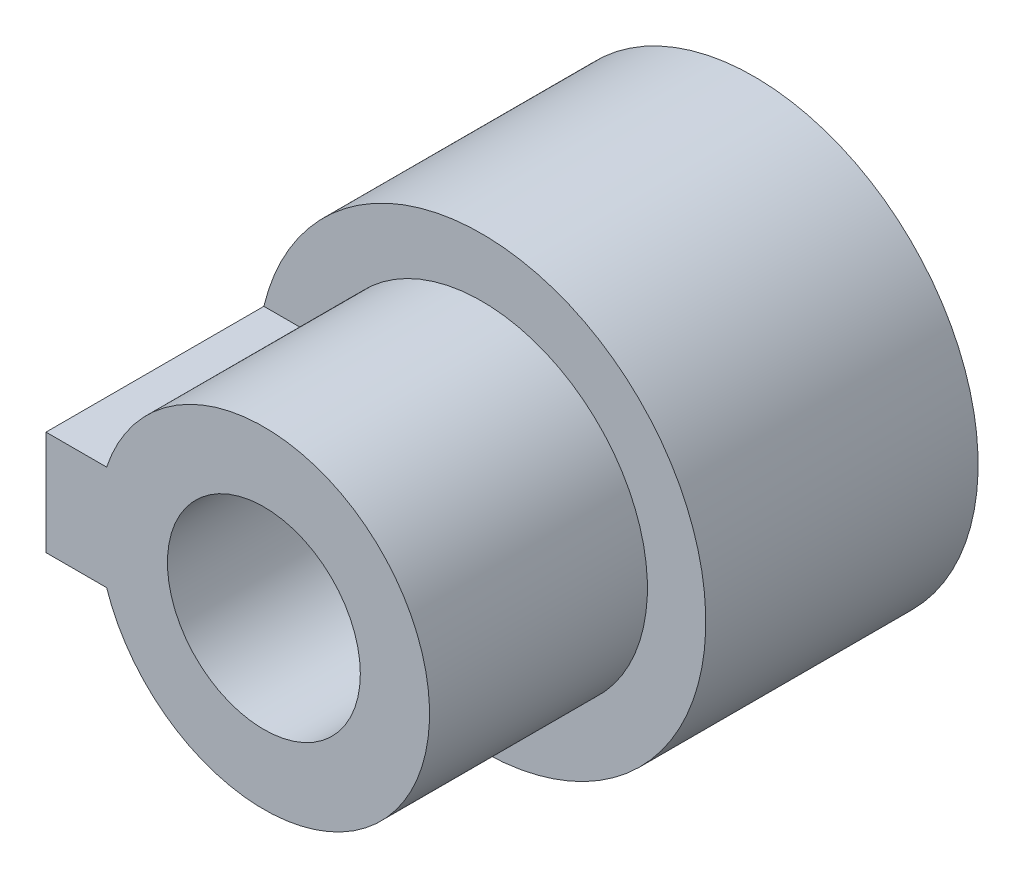
ISO-10303-21;
HEADER;
FILE_DESCRIPTION(('STEP AP214'),'2;1');
FILE_NAME('part.step','',(''),(''),'','','');
FILE_SCHEMA(('AUTOMOTIVE_DESIGN { 1 0 10303 214 1 1 1 1 }'));
ENDSEC;
DATA;
#1=APPLICATION_CONTEXT('core data for automotive mechanical design processes');
#2=APPLICATION_PROTOCOL_DEFINITION('international standard','automotive_design',2000,#1);
#3=PRODUCT_CONTEXT('',#1,'mechanical');
#4=PRODUCT('Part','Part','',(#3));
#5=PRODUCT_RELATED_PRODUCT_CATEGORY('part','',(#4));
#6=PRODUCT_DEFINITION_FORMATION('','',#4);
#7=PRODUCT_DEFINITION_CONTEXT('part definition',#1,'design');
#8=PRODUCT_DEFINITION('design','',#6,#7);
#9=PRODUCT_DEFINITION_SHAPE('','',#8);
#10=(LENGTH_UNIT() NAMED_UNIT(*) SI_UNIT(.MILLI.,.METRE.));
#11=(NAMED_UNIT(*) PLANE_ANGLE_UNIT() SI_UNIT($,.RADIAN.));
#12=(NAMED_UNIT(*) SI_UNIT($,.STERADIAN.) SOLID_ANGLE_UNIT());
#13=UNCERTAINTY_MEASURE_WITH_UNIT(LENGTH_MEASURE(1.E-05),#10,'distance_accuracy_value','');
#14=(GEOMETRIC_REPRESENTATION_CONTEXT(3) GLOBAL_UNCERTAINTY_ASSIGNED_CONTEXT((#13)) GLOBAL_UNIT_ASSIGNED_CONTEXT((#10,
#11,#12)) REPRESENTATION_CONTEXT('',''));
#15=CARTESIAN_POINT('',(0.,0.,0.));
#16=DIRECTION('',(0.,0.,1.));
#17=DIRECTION('',(1.,0.,0.));
#18=AXIS2_PLACEMENT_3D('',#15,#16,#17);
#19=CARTESIAN_POINT('',(0.,-2.3,10.));
#20=DIRECTION('',(0.,1.,0.));
#21=DIRECTION('',(-1.,0.,0.));
#22=AXIS2_PLACEMENT_3D('',#19,#20,#21);
#23=PLANE('',#22);
#24=DIRECTION('',(1.,0.,0.));
#25=VECTOR('',#24,1.);
#26=CARTESIAN_POINT('',(-9.6,-2.3,14.6));
#27=LINE('',#26,#25);
#28=CARTESIAN_POINT('',(-9.6,-2.3,14.6));
#29=VERTEX_POINT('',#28);
#30=CARTESIAN_POINT('',(-6.92820323027551,-2.3,14.6));
#31=VERTEX_POINT('',#30);
#32=EDGE_CURVE('E113',#29,#31,#27,.T.);
#33=ORIENTED_EDGE('',*,*,#32,.F.);
#34=DIRECTION('',(0.,0.,-1.));
#35=VECTOR('',#34,1.);
#36=CARTESIAN_POINT('',(-9.6,-2.3,10.));
#37=LINE('',#36,#35);
#38=CARTESIAN_POINT('',(-9.6,-2.3,5.));
#39=VERTEX_POINT('',#38);
#40=EDGE_CURVE('E58',#29,#39,#37,.T.);
#41=ORIENTED_EDGE('',*,*,#40,.T.);
#42=DIRECTION('',(1.,0.,0.));
#43=VECTOR('',#42,1.);
#44=CARTESIAN_POINT('',(0.,-2.3,5.));
#45=LINE('',#44,#43);
#46=CARTESIAN_POINT('',(-6.92820323027551,-2.3,5.));
#47=VERTEX_POINT('',#46);
#48=EDGE_CURVE('E224',#39,#47,#45,.T.);
#49=ORIENTED_EDGE('',*,*,#48,.T.);
#50=DIRECTION('',(0.,0.,-1.));
#51=VECTOR('',#50,1.);
#52=CARTESIAN_POINT('',(-6.92820323027551,-2.3,10.));
#53=LINE('',#52,#51);
#54=EDGE_CURVE('E119',#31,#47,#53,.T.);
#55=ORIENTED_EDGE('',*,*,#54,.F.);
#56=EDGE_LOOP('',(#33,#41,#49,#55));
#57=FACE_BOUND('',#56,.T.);
#58=ADVANCED_FACE('F35',(#57),#23,.F.);
#59=CARTESIAN_POINT('',(0.,0.,10.));
#60=DIRECTION('',(0.,0.,-1.));
#61=DIRECTION('',(-1.,0.,0.));
#62=AXIS2_PLACEMENT_3D('',#59,#60,#61);
#63=CYLINDRICAL_SURFACE('',#62,7.3);
#64=CARTESIAN_POINT('',(0.,0.,14.6));
#65=DIRECTION('',(0.,0.,1.));
#66=DIRECTION('',(1.,0.,0.));
#67=AXIS2_PLACEMENT_3D('',#64,#65,#66);
#68=CIRCLE('',#67,7.3);
#69=CARTESIAN_POINT('',(-6.92820323027551,2.29999999999999,14.6));
#70=VERTEX_POINT('',#69);
#71=EDGE_CURVE('E120',#31,#70,#68,.T.);
#72=ORIENTED_EDGE('',*,*,#71,.F.);
#73=ORIENTED_EDGE('',*,*,#54,.T.);
#74=CARTESIAN_POINT('',(0.,0.,5.));
#75=DIRECTION('',(0.,0.,1.));
#76=DIRECTION('',(1.,0.,0.));
#77=AXIS2_PLACEMENT_3D('',#74,#75,#76);
#78=CIRCLE('',#77,7.3);
#79=CARTESIAN_POINT('',(-6.92820323027551,2.3,5.));
#80=VERTEX_POINT('',#79);
#81=EDGE_CURVE('E214',#47,#80,#78,.T.);
#82=ORIENTED_EDGE('',*,*,#81,.T.);
#83=DIRECTION('',(0.,0.,-1.));
#84=VECTOR('',#83,1.);
#85=CARTESIAN_POINT('',(-6.92820323027551,2.3,10.));
#86=LINE('',#85,#84);
#87=EDGE_CURVE('E127',#70,#80,#86,.T.);
#88=ORIENTED_EDGE('',*,*,#87,.F.);
#89=EDGE_LOOP('',(#72,#73,#82,#88));
#90=FACE_BOUND('',#89,.T.);
#91=ADVANCED_FACE('F189',(#90),#63,.T.);
#92=CARTESIAN_POINT('',(0.,2.3,10.));
#93=DIRECTION('',(0.,1.,0.));
#94=DIRECTION('',(0.,0.,1.));
#95=AXIS2_PLACEMENT_3D('',#92,#93,#94);
#96=PLANE('',#95);
#97=DIRECTION('',(0.,0.,-1.));
#98=VECTOR('',#97,1.);
#99=CARTESIAN_POINT('',(-9.6,2.3,10.));
#100=LINE('',#99,#98);
#101=CARTESIAN_POINT('',(-9.6,2.3,14.6));
#102=VERTEX_POINT('',#101);
#103=CARTESIAN_POINT('',(-9.6,2.29999999999999,5.));
#104=VERTEX_POINT('',#103);
#105=EDGE_CURVE('E124',#102,#104,#100,.T.);
#106=ORIENTED_EDGE('',*,*,#105,.F.);
#107=DIRECTION('',(-1.,0.,0.));
#108=VECTOR('',#107,1.);
#109=CARTESIAN_POINT('',(-6.92820323027551,2.29999999999999,14.6));
#110=LINE('',#109,#108);
#111=EDGE_CURVE('E50',#70,#102,#110,.T.);
#112=ORIENTED_EDGE('',*,*,#111,.F.);
#113=ORIENTED_EDGE('',*,*,#87,.T.);
#114=DIRECTION('',(1.,0.,0.));
#115=VECTOR('',#114,1.);
#116=CARTESIAN_POINT('',(0.,2.3,5.));
#117=LINE('',#116,#115);
#118=EDGE_CURVE('E221',#104,#80,#117,.T.);
#119=ORIENTED_EDGE('',*,*,#118,.F.);
#120=EDGE_LOOP('',(#106,#112,#113,#119));
#121=FACE_BOUND('',#120,.T.);
#122=ADVANCED_FACE('F193',(#121),#96,.T.);
#123=CARTESIAN_POINT('',(-9.6,0.,10.));
#124=DIRECTION('',(1.,0.,0.));
#125=DIRECTION('',(0.,0.,-1.));
#126=AXIS2_PLACEMENT_3D('',#123,#124,#125);
#127=PLANE('',#126);
#128=DIRECTION('',(0.,-1.,0.));
#129=VECTOR('',#128,1.);
#130=CARTESIAN_POINT('',(-9.6,2.3,14.6));
#131=LINE('',#130,#129);
#132=EDGE_CURVE('E111',#102,#29,#131,.T.);
#133=ORIENTED_EDGE('',*,*,#132,.F.);
#134=ORIENTED_EDGE('',*,*,#105,.T.);
#135=DIRECTION('',(0.,-1.,0.));
#136=VECTOR('',#135,1.);
#137=CARTESIAN_POINT('',(-9.6,0.,5.));
#138=LINE('',#137,#136);
#139=EDGE_CURVE('E11',#104,#39,#138,.T.);
#140=ORIENTED_EDGE('',*,*,#139,.T.);
#141=ORIENTED_EDGE('',*,*,#40,.F.);
#142=EDGE_LOOP('',(#133,#134,#140,#141));
#143=FACE_BOUND('',#142,.T.);
#144=ADVANCED_FACE('F122',(#143),#127,.F.);
#145=CARTESIAN_POINT('',(0.,0.,10.));
#146=DIRECTION('',(0.,0.,-1.));
#147=DIRECTION('',(-1.,0.,0.));
#148=AXIS2_PLACEMENT_3D('',#145,#146,#147);
#149=CYLINDRICAL_SURFACE('',#148,4.25);
#150=CARTESIAN_POINT('',(0.,0.,0.));
#151=DIRECTION('',(0.,0.,1.));
#152=DIRECTION('',(1.,0.,0.));
#153=AXIS2_PLACEMENT_3D('',#150,#151,#152);
#154=CIRCLE('',#153,4.25);
#155=CARTESIAN_POINT('',(4.25,0.,0.));
#156=VERTEX_POINT('',#155);
#157=EDGE_CURVE('E125',#156,#156,#154,.T.);
#158=ORIENTED_EDGE('',*,*,#157,.F.);
#159=EDGE_LOOP('',(#158));
#160=FACE_BOUND('',#159,.T.);
#161=CARTESIAN_POINT('',(0.,0.,14.6));
#162=DIRECTION('',(0.,0.,1.));
#163=DIRECTION('',(1.,0.,0.));
#164=AXIS2_PLACEMENT_3D('',#161,#162,#163);
#165=CIRCLE('',#164,4.25);
#166=CARTESIAN_POINT('',(4.25,0.,14.6));
#167=VERTEX_POINT('',#166);
#168=EDGE_CURVE('E38',#167,#167,#165,.T.);
#169=ORIENTED_EDGE('',*,*,#168,.T.);
#170=EDGE_LOOP('',(#169));
#171=FACE_BOUND('',#170,.T.);
#172=ADVANCED_FACE('F202',(#160,#171),#149,.F.);
#173=CARTESIAN_POINT('',(0.,0.,0.));
#174=DIRECTION('',(0.,0.,1.));
#175=DIRECTION('',(1.,0.,0.));
#176=AXIS2_PLACEMENT_3D('',#173,#174,#175);
#177=PLANE('',#176);
#178=DIRECTION('',(0.,-1.,0.));
#179=VECTOR('',#178,1.);
#180=CARTESIAN_POINT('',(6.5,3.75277674973257,0.));
#181=LINE('',#180,#179);
#182=CARTESIAN_POINT('',(6.5,3.75277674973257,0.));
#183=VERTEX_POINT('',#182);
#184=CARTESIAN_POINT('',(6.5,-3.75277674973257,0.));
#185=VERTEX_POINT('',#184);
#186=EDGE_CURVE('E135',#183,#185,#181,.T.);
#187=ORIENTED_EDGE('',*,*,#186,.T.);
#188=DIRECTION('',(-0.866025403784439,-0.5,0.));
#189=VECTOR('',#188,1.);
#190=CARTESIAN_POINT('',(6.5,-3.75277674973257,0.));
#191=LINE('',#190,#189);
#192=CARTESIAN_POINT('',(0.,-7.50555349946513,0.));
#193=VERTEX_POINT('',#192);
#194=EDGE_CURVE('E43',#185,#193,#191,.T.);
#195=ORIENTED_EDGE('',*,*,#194,.T.);
#196=DIRECTION('',(-0.866025403784438,0.5,0.));
#197=VECTOR('',#196,1.);
#198=CARTESIAN_POINT('',(0.,-7.50555349946513,0.));
#199=LINE('',#198,#197);
#200=CARTESIAN_POINT('',(-6.5,-3.75277674973256,0.));
#201=VERTEX_POINT('',#200);
#202=EDGE_CURVE('E239',#193,#201,#199,.T.);
#203=ORIENTED_EDGE('',*,*,#202,.T.);
#204=DIRECTION('',(0.,1.,0.));
#205=VECTOR('',#204,1.);
#206=CARTESIAN_POINT('',(-6.5,-3.75277674973256,0.));
#207=LINE('',#206,#205);
#208=CARTESIAN_POINT('',(-6.5,3.75277674973257,0.));
#209=VERTEX_POINT('',#208);
#210=EDGE_CURVE('E241',#201,#209,#207,.T.);
#211=ORIENTED_EDGE('',*,*,#210,.T.);
#212=DIRECTION('',(0.866025403784439,0.5,0.));
#213=VECTOR('',#212,1.);
#214=CARTESIAN_POINT('',(-6.5,3.75277674973257,0.));
#215=LINE('',#214,#213);
#216=CARTESIAN_POINT('',(0.,7.50555349946514,0.));
#217=VERTEX_POINT('',#216);
#218=EDGE_CURVE('E145',#209,#217,#215,.T.);
#219=ORIENTED_EDGE('',*,*,#218,.T.);
#220=DIRECTION('',(0.866025403784439,-0.5,0.));
#221=VECTOR('',#220,1.);
#222=CARTESIAN_POINT('',(0.,7.50555349946514,0.));
#223=LINE('',#222,#221);
#224=EDGE_CURVE('E140',#217,#183,#223,.T.);
#225=ORIENTED_EDGE('',*,*,#224,.T.);
#226=EDGE_LOOP('',(#187,#195,#203,#211,#219,#225));
#227=FACE_BOUND('',#226,.T.);
#228=ORIENTED_EDGE('',*,*,#157,.T.);
#229=EDGE_LOOP('',(#228));
#230=FACE_BOUND('',#229,.T.);
#231=ADVANCED_FACE('F184',(#227,#230),#177,.F.);
#232=CARTESIAN_POINT('',(0.,0.,-7.));
#233=DIRECTION('',(0.,0.,-1.));
#234=DIRECTION('',(-1.,0.,0.));
#235=AXIS2_PLACEMENT_3D('',#232,#233,#234);
#236=PLANE('',#235);
#237=CARTESIAN_POINT('',(0.,0.,-7.));
#238=DIRECTION('',(0.,0.,-1.));
#239=DIRECTION('',(-1.,0.,0.));
#240=AXIS2_PLACEMENT_3D('',#237,#238,#239);
#241=CIRCLE('',#240,9.87167665596883);
#242=CARTESIAN_POINT('',(-9.87167665596883,0.,-7.));
#243=VERTEX_POINT('',#242);
#244=EDGE_CURVE('E130',#243,#243,#241,.T.);
#245=ORIENTED_EDGE('',*,*,#244,.T.);
#246=EDGE_LOOP('',(#245));
#247=FACE_BOUND('',#246,.T.);
#248=DIRECTION('',(-0.866025403784438,0.5,0.));
#249=VECTOR('',#248,1.);
#250=CARTESIAN_POINT('',(0.,-7.50555349946513,-7.));
#251=LINE('',#250,#249);
#252=CARTESIAN_POINT('',(0.,-7.50555349946513,-7.));
#253=VERTEX_POINT('',#252);
#254=CARTESIAN_POINT('',(-6.5,-3.75277674973256,-7.));
#255=VERTEX_POINT('',#254);
#256=EDGE_CURVE('E228',#253,#255,#251,.T.);
#257=ORIENTED_EDGE('',*,*,#256,.F.);
#258=DIRECTION('',(-0.866025403784439,-0.5,0.));
#259=VECTOR('',#258,1.);
#260=CARTESIAN_POINT('',(6.5,-3.75277674973257,-7.));
#261=LINE('',#260,#259);
#262=CARTESIAN_POINT('',(6.5,-3.75277674973257,-7.));
#263=VERTEX_POINT('',#262);
#264=EDGE_CURVE('E226',#263,#253,#261,.T.);
#265=ORIENTED_EDGE('',*,*,#264,.F.);
#266=DIRECTION('',(0.,-1.,0.));
#267=VECTOR('',#266,1.);
#268=CARTESIAN_POINT('',(6.5,3.75277674973257,-7.));
#269=LINE('',#268,#267);
#270=CARTESIAN_POINT('',(6.5,3.75277674973257,-7.));
#271=VERTEX_POINT('',#270);
#272=EDGE_CURVE('E152',#271,#263,#269,.T.);
#273=ORIENTED_EDGE('',*,*,#272,.F.);
#274=DIRECTION('',(0.866025403784439,-0.5,0.));
#275=VECTOR('',#274,1.);
#276=CARTESIAN_POINT('',(0.,7.50555349946514,-7.));
#277=LINE('',#276,#275);
#278=CARTESIAN_POINT('',(0.,7.50555349946514,-7.));
#279=VERTEX_POINT('',#278);
#280=EDGE_CURVE('E234',#279,#271,#277,.T.);
#281=ORIENTED_EDGE('',*,*,#280,.F.);
#282=DIRECTION('',(0.866025403784439,0.5,0.));
#283=VECTOR('',#282,1.);
#284=CARTESIAN_POINT('',(-6.5,3.75277674973257,-7.));
#285=LINE('',#284,#283);
#286=CARTESIAN_POINT('',(-6.5,3.75277674973257,-7.));
#287=VERTEX_POINT('',#286);
#288=EDGE_CURVE('E232',#287,#279,#285,.T.);
#289=ORIENTED_EDGE('',*,*,#288,.F.);
#290=DIRECTION('',(0.,1.,0.));
#291=VECTOR('',#290,1.);
#292=CARTESIAN_POINT('',(-6.5,-3.75277674973256,-7.));
#293=LINE('',#292,#291);
#294=EDGE_CURVE('E230',#255,#287,#293,.T.);
#295=ORIENTED_EDGE('',*,*,#294,.F.);
#296=EDGE_LOOP('',(#257,#265,#273,#281,#289,#295));
#297=FACE_BOUND('',#296,.T.);
#298=ADVANCED_FACE('F169',(#247,#297),#236,.T.);
#299=CARTESIAN_POINT('',(0.,0.,-7.));
#300=DIRECTION('',(0.,0.,1.));
#301=DIRECTION('',(1.,0.,0.));
#302=AXIS2_PLACEMENT_3D('',#299,#300,#301);
#303=CYLINDRICAL_SURFACE('',#302,9.87167665596883);
#304=CARTESIAN_POINT('',(0.,0.,5.));
#305=DIRECTION('',(0.,0.,1.));
#306=DIRECTION('',(1.,0.,0.));
#307=AXIS2_PLACEMENT_3D('',#304,#305,#306);
#308=CIRCLE('',#307,9.87167665596883);
#309=EDGE_CURVE('E215',#39,#104,#308,.T.);
#310=ORIENTED_EDGE('',*,*,#309,.F.);
#311=EDGE_CURVE('E219',#104,#39,#308,.T.);
#312=ORIENTED_EDGE('',*,*,#311,.F.);
#313=EDGE_LOOP('',(#310,#312));
#314=FACE_BOUND('',#313,.T.);
#315=ORIENTED_EDGE('',*,*,#244,.F.);
#316=EDGE_LOOP('',(#315));
#317=FACE_BOUND('',#316,.T.);
#318=ADVANCED_FACE('F172',(#314,#317),#303,.T.);
#319=CARTESIAN_POINT('',(6.5,-3.75277674973257,-7.));
#320=DIRECTION('',(-0.5,0.866025403784439,0.));
#321=DIRECTION('',(-0.866025403784439,-0.5,0.));
#322=AXIS2_PLACEMENT_3D('',#319,#320,#321);
#323=PLANE('',#322);
#324=ORIENTED_EDGE('',*,*,#194,.F.);
#325=DIRECTION('',(0.,0.,1.));
#326=VECTOR('',#325,1.);
#327=CARTESIAN_POINT('',(6.5,-3.75277674973257,-7.));
#328=LINE('',#327,#326);
#329=EDGE_CURVE('E149',#263,#185,#328,.T.);
#330=ORIENTED_EDGE('',*,*,#329,.F.);
#331=ORIENTED_EDGE('',*,*,#264,.T.);
#332=DIRECTION('',(0.,0.,1.));
#333=VECTOR('',#332,1.);
#334=CARTESIAN_POINT('',(0.,-7.50555349946513,-7.));
#335=LINE('',#334,#333);
#336=EDGE_CURVE('E164',#253,#193,#335,.T.);
#337=ORIENTED_EDGE('',*,*,#336,.T.);
#338=EDGE_LOOP('',(#324,#330,#331,#337));
#339=FACE_BOUND('',#338,.T.);
#340=ADVANCED_FACE('F174',(#339),#323,.T.);
#341=CARTESIAN_POINT('',(0.,-7.50555349946513,-7.));
#342=DIRECTION('',(0.5,0.866025403784438,0.));
#343=DIRECTION('',(-0.866025403784439,0.5,0.));
#344=AXIS2_PLACEMENT_3D('',#341,#342,#343);
#345=PLANE('',#344);
#346=ORIENTED_EDGE('',*,*,#202,.F.);
#347=ORIENTED_EDGE('',*,*,#336,.F.);
#348=ORIENTED_EDGE('',*,*,#256,.T.);
#349=DIRECTION('',(0.,0.,1.));
#350=VECTOR('',#349,1.);
#351=CARTESIAN_POINT('',(-6.5,-3.75277674973256,-7.));
#352=LINE('',#351,#350);
#353=EDGE_CURVE('E161',#255,#201,#352,.T.);
#354=ORIENTED_EDGE('',*,*,#353,.T.);
#355=EDGE_LOOP('',(#346,#347,#348,#354));
#356=FACE_BOUND('',#355,.T.);
#357=ADVANCED_FACE('F181',(#356),#345,.T.);
#358=CARTESIAN_POINT('',(-6.5,-3.75277674973256,-7.));
#359=DIRECTION('',(1.,0.,0.));
#360=DIRECTION('',(0.,0.,-1.));
#361=AXIS2_PLACEMENT_3D('',#358,#359,#360);
#362=PLANE('',#361);
#363=ORIENTED_EDGE('',*,*,#210,.F.);
#364=ORIENTED_EDGE('',*,*,#353,.F.);
#365=ORIENTED_EDGE('',*,*,#294,.T.);
#366=DIRECTION('',(0.,0.,1.));
#367=VECTOR('',#366,1.);
#368=CARTESIAN_POINT('',(-6.5,3.75277674973257,-7.));
#369=LINE('',#368,#367);
#370=EDGE_CURVE('E158',#287,#209,#369,.T.);
#371=ORIENTED_EDGE('',*,*,#370,.T.);
#372=EDGE_LOOP('',(#363,#364,#365,#371));
#373=FACE_BOUND('',#372,.T.);
#374=ADVANCED_FACE('F265',(#373),#362,.T.);
#375=CARTESIAN_POINT('',(-6.5,3.75277674973257,-7.));
#376=DIRECTION('',(0.5,-0.866025403784439,0.));
#377=DIRECTION('',(0.866025403784439,0.5,0.));
#378=AXIS2_PLACEMENT_3D('',#375,#376,#377);
#379=PLANE('',#378);
#380=ORIENTED_EDGE('',*,*,#218,.F.);
#381=ORIENTED_EDGE('',*,*,#370,.F.);
#382=ORIENTED_EDGE('',*,*,#288,.T.);
#383=DIRECTION('',(0.,0.,1.));
#384=VECTOR('',#383,1.);
#385=CARTESIAN_POINT('',(0.,7.50555349946514,-7.));
#386=LINE('',#385,#384);
#387=EDGE_CURVE('E155',#279,#217,#386,.T.);
#388=ORIENTED_EDGE('',*,*,#387,.T.);
#389=EDGE_LOOP('',(#380,#381,#382,#388));
#390=FACE_BOUND('',#389,.T.);
#391=ADVANCED_FACE('F251',(#390),#379,.T.);
#392=CARTESIAN_POINT('',(0.,7.50555349946514,-7.));
#393=DIRECTION('',(-0.5,-0.866025403784438,0.));
#394=DIRECTION('',(0.866025403784439,-0.5,0.));
#395=AXIS2_PLACEMENT_3D('',#392,#393,#394);
#396=PLANE('',#395);
#397=ORIENTED_EDGE('',*,*,#224,.F.);
#398=ORIENTED_EDGE('',*,*,#387,.F.);
#399=ORIENTED_EDGE('',*,*,#280,.T.);
#400=DIRECTION('',(0.,0.,1.));
#401=VECTOR('',#400,1.);
#402=CARTESIAN_POINT('',(6.5,3.75277674973257,-7.));
#403=LINE('',#402,#401);
#404=EDGE_CURVE('E151',#271,#183,#403,.T.);
#405=ORIENTED_EDGE('',*,*,#404,.T.);
#406=EDGE_LOOP('',(#397,#398,#399,#405));
#407=FACE_BOUND('',#406,.T.);
#408=ADVANCED_FACE('F249',(#407),#396,.T.);
#409=CARTESIAN_POINT('',(6.5,3.75277674973257,-7.));
#410=DIRECTION('',(-1.,0.,0.));
#411=DIRECTION('',(0.,0.,1.));
#412=AXIS2_PLACEMENT_3D('',#409,#410,#411);
#413=PLANE('',#412);
#414=ORIENTED_EDGE('',*,*,#186,.F.);
#415=ORIENTED_EDGE('',*,*,#404,.F.);
#416=ORIENTED_EDGE('',*,*,#272,.T.);
#417=ORIENTED_EDGE('',*,*,#329,.T.);
#418=EDGE_LOOP('',(#414,#415,#416,#417));
#419=FACE_BOUND('',#418,.T.);
#420=ADVANCED_FACE('F259',(#419),#413,.T.);
#421=CARTESIAN_POINT('',(0.,0.,5.));
#422=DIRECTION('',(0.,0.,1.));
#423=DIRECTION('',(1.,0.,0.));
#424=AXIS2_PLACEMENT_3D('',#421,#422,#423);
#425=PLANE('',#424);
#426=ORIENTED_EDGE('',*,*,#48,.F.);
#427=ORIENTED_EDGE('',*,*,#309,.T.);
#428=ORIENTED_EDGE('',*,*,#118,.T.);
#429=ORIENTED_EDGE('',*,*,#81,.F.);
#430=EDGE_LOOP('',(#426,#427,#428,#429));
#431=FACE_BOUND('',#430,.T.);
#432=ADVANCED_FACE('F279',(#431),#425,.T.);
#433=ORIENTED_EDGE('',*,*,#139,.F.);
#434=ORIENTED_EDGE('',*,*,#311,.T.);
#435=EDGE_LOOP('',(#433,#434));
#436=FACE_BOUND('',#435,.T.);
#437=ADVANCED_FACE('F282',(#436),#425,.T.);
#438=CARTESIAN_POINT('',(0.,0.,14.6));
#439=DIRECTION('',(0.,0.,1.));
#440=DIRECTION('',(1.,0.,0.));
#441=AXIS2_PLACEMENT_3D('',#438,#439,#440);
#442=PLANE('',#441);
#443=ORIENTED_EDGE('',*,*,#168,.F.);
#444=EDGE_LOOP('',(#443));
#445=FACE_BOUND('',#444,.T.);
#446=ORIENTED_EDGE('',*,*,#111,.T.);
#447=ORIENTED_EDGE('',*,*,#132,.T.);
#448=ORIENTED_EDGE('',*,*,#32,.T.);
#449=ORIENTED_EDGE('',*,*,#71,.T.);
#450=EDGE_LOOP('',(#446,#447,#448,#449));
#451=FACE_BOUND('',#450,.T.);
#452=ADVANCED_FACE('F112',(#445,#451),#442,.T.);
#453=CLOSED_SHELL('',(#58,#91,#122,#144,#172,#231,#298,#318,#340,#357,#374,#391,#408,#420,#432,
#437,#452));
#454=MANIFOLD_SOLID_BREP('B2',#453);
#455=ADVANCED_BREP_SHAPE_REPRESENTATION('',(#18,#454),#14);
#456=SHAPE_DEFINITION_REPRESENTATION(#9,#455);
ENDSEC;
END-ISO-10303-21;
